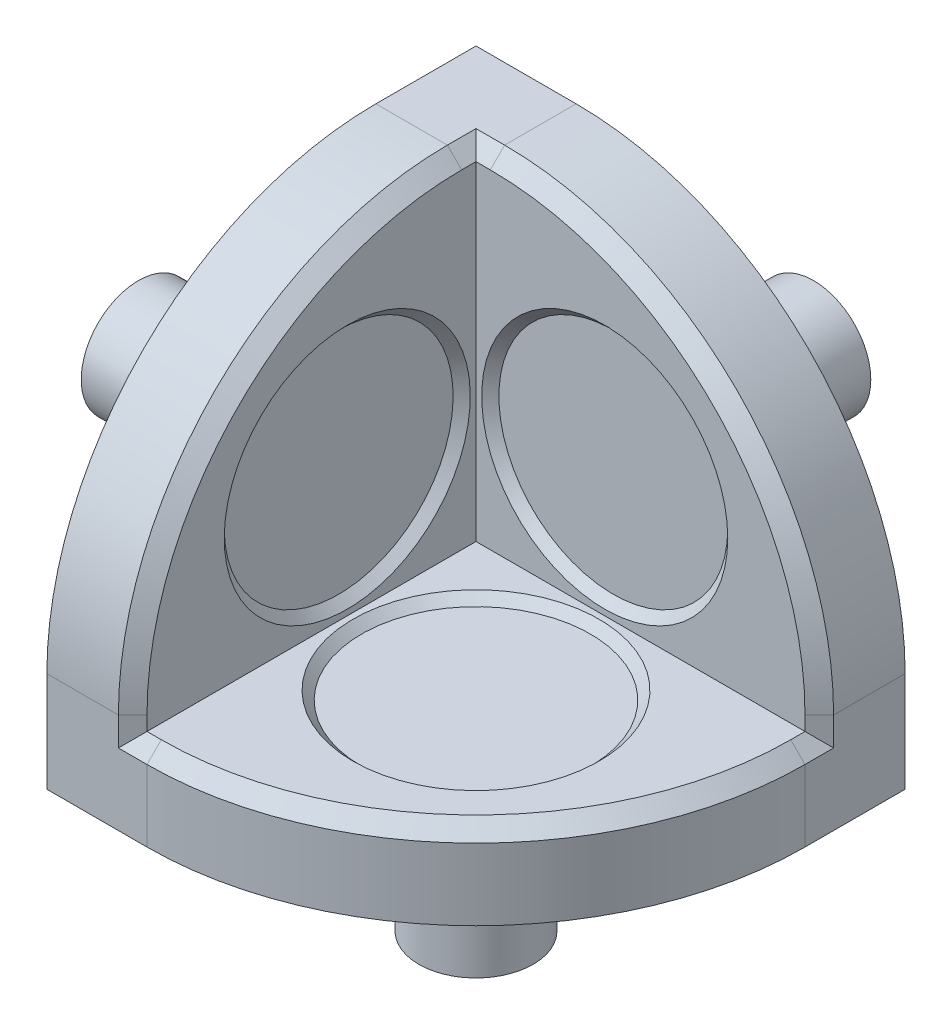
ISO-10303-21;
HEADER;
FILE_DESCRIPTION(('STEP AP214'),'2;1');
FILE_NAME('part.step','',(''),(''),'','','');
FILE_SCHEMA(('AUTOMOTIVE_DESIGN { 1 0 10303 214 1 1 1 1 }'));
ENDSEC;
DATA;
#1=APPLICATION_CONTEXT('core data for automotive mechanical design processes');
#2=APPLICATION_PROTOCOL_DEFINITION('international standard','automotive_design',2000,#1);
#3=PRODUCT_CONTEXT('',#1,'mechanical');
#4=PRODUCT('Part','Part','',(#3));
#5=PRODUCT_RELATED_PRODUCT_CATEGORY('part','',(#4));
#6=PRODUCT_DEFINITION_FORMATION('','',#4);
#7=PRODUCT_DEFINITION_CONTEXT('part definition',#1,'design');
#8=PRODUCT_DEFINITION('design','',#6,#7);
#9=PRODUCT_DEFINITION_SHAPE('','',#8);
#10=(LENGTH_UNIT() NAMED_UNIT(*) SI_UNIT(.MILLI.,.METRE.));
#11=(NAMED_UNIT(*) PLANE_ANGLE_UNIT() SI_UNIT($,.RADIAN.));
#12=(NAMED_UNIT(*) SI_UNIT($,.STERADIAN.) SOLID_ANGLE_UNIT());
#13=UNCERTAINTY_MEASURE_WITH_UNIT(LENGTH_MEASURE(1.E-05),#10,'distance_accuracy_value','');
#14=(GEOMETRIC_REPRESENTATION_CONTEXT(3) GLOBAL_UNCERTAINTY_ASSIGNED_CONTEXT((#13)) GLOBAL_UNIT_ASSIGNED_CONTEXT((#10,
#11,#12)) REPRESENTATION_CONTEXT('',''));
#15=CARTESIAN_POINT('',(0.,0.,0.));
#16=DIRECTION('',(0.,0.,1.));
#17=DIRECTION('',(1.,0.,0.));
#18=AXIS2_PLACEMENT_3D('',#15,#16,#17);
#19=CARTESIAN_POINT('',(5.4,15.,15.));
#20=DIRECTION('',(1.,0.,0.));
#21=DIRECTION('',(0.,0.,-1.));
#22=AXIS2_PLACEMENT_3D('',#19,#20,#21);
#23=PLANE('',#22);
#24=CARTESIAN_POINT('',(5.39999999999996,15.,15.));
#25=DIRECTION('',(1.,0.,0.));
#26=DIRECTION('',(0.,1.,0.));
#27=AXIS2_PLACEMENT_3D('',#24,#25,#26);
#28=CIRCLE('',#27,8.00000000000004);
#29=CARTESIAN_POINT('',(5.39999999999996,23.,15.));
#30=VERTEX_POINT('',#29);
#31=EDGE_CURVE('E19',#30,#30,#28,.T.);
#32=ORIENTED_EDGE('',*,*,#31,.T.);
#33=EDGE_LOOP('',(#32));
#34=FACE_BOUND('',#33,.T.);
#35=ADVANCED_FACE('F15',(#34),#23,.T.);
#36=CARTESIAN_POINT('',(15.,5.4,15.));
#37=DIRECTION('',(0.,1.,0.));
#38=DIRECTION('',(0.,0.,1.));
#39=AXIS2_PLACEMENT_3D('',#36,#37,#38);
#40=PLANE('',#39);
#41=CARTESIAN_POINT('',(15.,5.39999999999968,15.));
#42=DIRECTION('',(0.,1.,0.));
#43=DIRECTION('',(0.,0.,1.));
#44=AXIS2_PLACEMENT_3D('',#41,#42,#43);
#45=CIRCLE('',#44,7.99999999999977);
#46=CARTESIAN_POINT('',(15.,5.39999999999968,22.9999999999998));
#47=VERTEX_POINT('',#46);
#48=EDGE_CURVE('E358',#47,#47,#45,.T.);
#49=ORIENTED_EDGE('',*,*,#48,.T.);
#50=EDGE_LOOP('',(#49));
#51=FACE_BOUND('',#50,.T.);
#52=ADVANCED_FACE('F682',(#51),#40,.T.);
#53=CARTESIAN_POINT('',(15.,-8.6,15.));
#54=DIRECTION('',(0.,1.,0.));
#55=DIRECTION('',(0.,0.,1.));
#56=AXIS2_PLACEMENT_3D('',#53,#54,#55);
#57=PLANE('',#56);
#58=CARTESIAN_POINT('',(15.,-8.6,15.));
#59=DIRECTION('',(0.,1.,0.));
#60=DIRECTION('',(0.,0.,1.));
#61=AXIS2_PLACEMENT_3D('',#58,#59,#60);
#62=CIRCLE('',#61,4.);
#63=CARTESIAN_POINT('',(15.,-8.6,19.));
#64=VERTEX_POINT('',#63);
#65=EDGE_CURVE('E356',#64,#64,#62,.T.);
#66=ORIENTED_EDGE('',*,*,#65,.F.);
#67=EDGE_LOOP('',(#66));
#68=FACE_BOUND('',#67,.T.);
#69=ADVANCED_FACE('F382',(#68),#57,.F.);
#70=CARTESIAN_POINT('',(-8.6,15.,15.));
#71=DIRECTION('',(1.,0.,0.));
#72=DIRECTION('',(0.,0.,-1.));
#73=AXIS2_PLACEMENT_3D('',#70,#71,#72);
#74=PLANE('',#73);
#75=CARTESIAN_POINT('',(-8.6,15.,15.));
#76=DIRECTION('',(1.,0.,0.));
#77=DIRECTION('',(0.,0.,-1.));
#78=AXIS2_PLACEMENT_3D('',#75,#76,#77);
#79=CIRCLE('',#78,4.);
#80=CARTESIAN_POINT('',(-8.6,15.,11.));
#81=VERTEX_POINT('',#80);
#82=EDGE_CURVE('E353',#81,#81,#79,.T.);
#83=ORIENTED_EDGE('',*,*,#82,.F.);
#84=EDGE_LOOP('',(#83));
#85=FACE_BOUND('',#84,.T.);
#86=ADVANCED_FACE('F369',(#85),#74,.F.);
#87=CARTESIAN_POINT('',(6.00000000000004,15.,15.));
#88=DIRECTION('',(1.,0.,0.));
#89=DIRECTION('',(0.,1.,0.));
#90=AXIS2_PLACEMENT_3D('',#87,#88,#89);
#91=CONICAL_SURFACE('',#90,8.59999999999996,0.7853981633973);
#92=CARTESIAN_POINT('',(6.00000000000004,15.,15.));
#93=DIRECTION('',(1.,0.,0.));
#94=DIRECTION('',(0.,1.,0.));
#95=AXIS2_PLACEMENT_3D('',#92,#93,#94);
#96=CIRCLE('',#95,8.59999999999996);
#97=CARTESIAN_POINT('',(6.00000000000004,23.6,15.));
#98=VERTEX_POINT('',#97);
#99=EDGE_CURVE('E349',#98,#98,#96,.F.);
#100=ORIENTED_EDGE('',*,*,#99,.F.);
#101=EDGE_LOOP('',(#100));
#102=FACE_BOUND('',#101,.T.);
#103=ORIENTED_EDGE('',*,*,#31,.F.);
#104=EDGE_LOOP('',(#103));
#105=FACE_BOUND('',#104,.T.);
#106=ADVANCED_FACE('F366',(#102,#105),#91,.F.);
#107=CARTESIAN_POINT('',(15.,5.999999999997,15.));
#108=DIRECTION('',(0.,1.,0.));
#109=DIRECTION('',(0.,0.,1.));
#110=AXIS2_PLACEMENT_3D('',#107,#108,#109);
#111=CONICAL_SURFACE('',#110,8.59999999999691,0.7853981633973);
#112=CARTESIAN_POINT('',(15.,5.999999999997,15.));
#113=DIRECTION('',(0.,1.,0.));
#114=DIRECTION('',(0.,0.,1.));
#115=AXIS2_PLACEMENT_3D('',#112,#113,#114);
#116=CIRCLE('',#115,8.59999999999691);
#117=CARTESIAN_POINT('',(15.,5.999999999997,23.5999999999969));
#118=VERTEX_POINT('',#117);
#119=EDGE_CURVE('E307',#118,#118,#116,.F.);
#120=ORIENTED_EDGE('',*,*,#119,.F.);
#121=EDGE_LOOP('',(#120));
#122=FACE_BOUND('',#121,.T.);
#123=ORIENTED_EDGE('',*,*,#48,.F.);
#124=EDGE_LOOP('',(#123));
#125=FACE_BOUND('',#124,.T.);
#126=ADVANCED_FACE('F368',(#122,#125),#111,.F.);
#127=CARTESIAN_POINT('',(15.,15.,5.4));
#128=DIRECTION('',(0.,0.,1.));
#129=DIRECTION('',(1.,0.,0.));
#130=AXIS2_PLACEMENT_3D('',#127,#128,#129);
#131=PLANE('',#130);
#132=CARTESIAN_POINT('',(15.,15.,5.39999999999996));
#133=DIRECTION('',(0.,0.,1.));
#134=DIRECTION('',(1.,0.,0.));
#135=AXIS2_PLACEMENT_3D('',#132,#133,#134);
#136=CIRCLE('',#135,8.00000000000004);
#137=CARTESIAN_POINT('',(23.,15.,5.39999999999996));
#138=VERTEX_POINT('',#137);
#139=EDGE_CURVE('E344',#138,#138,#136,.T.);
#140=ORIENTED_EDGE('',*,*,#139,.T.);
#141=EDGE_LOOP('',(#140));
#142=FACE_BOUND('',#141,.T.);
#143=ADVANCED_FACE('F378',(#142),#131,.T.);
#144=CARTESIAN_POINT('',(15.,-9.3,15.));
#145=DIRECTION('',(0.,1.,0.));
#146=DIRECTION('',(0.,0.,1.));
#147=AXIS2_PLACEMENT_3D('',#144,#145,#146);
#148=CYLINDRICAL_SURFACE('',#147,4.);
#149=ORIENTED_EDGE('',*,*,#65,.T.);
#150=EDGE_LOOP('',(#149));
#151=FACE_BOUND('',#150,.T.);
#152=CARTESIAN_POINT('',(15.,1.39999999998963,15.));
#153=DIRECTION('',(0.,1.,0.));
#154=DIRECTION('',(1.,0.,0.));
#155=AXIS2_PLACEMENT_3D('',#152,#153,#154);
#156=CIRCLE('',#155,3.99999999994861);
#157=CARTESIAN_POINT('',(18.9999999999486,1.39999999998963,15.));
#158=VERTEX_POINT('',#157);
#159=EDGE_CURVE('E317',#158,#158,#156,.T.);
#160=ORIENTED_EDGE('',*,*,#159,.F.);
#161=EDGE_LOOP('',(#160));
#162=FACE_BOUND('',#161,.T.);
#163=ADVANCED_FACE('F513',(#151,#162),#148,.T.);
#164=CARTESIAN_POINT('',(-9.3,15.,15.));
#165=DIRECTION('',(1.,0.,0.));
#166=DIRECTION('',(0.,0.,-1.));
#167=AXIS2_PLACEMENT_3D('',#164,#165,#166);
#168=CYLINDRICAL_SURFACE('',#167,4.);
#169=ORIENTED_EDGE('',*,*,#82,.T.);
#170=EDGE_LOOP('',(#169));
#171=FACE_BOUND('',#170,.T.);
#172=CARTESIAN_POINT('',(1.40000000004648,15.,15.));
#173=DIRECTION('',(1.,0.,0.));
#174=DIRECTION('',(0.,-1.,0.));
#175=AXIS2_PLACEMENT_3D('',#172,#173,#174);
#176=CIRCLE('',#175,4.00000000003274);
#177=CARTESIAN_POINT('',(1.40000000004648,10.9999999999673,15.));
#178=VERTEX_POINT('',#177);
#179=EDGE_CURVE('E270',#178,#178,#176,.T.);
#180=ORIENTED_EDGE('',*,*,#179,.F.);
#181=EDGE_LOOP('',(#180));
#182=FACE_BOUND('',#181,.T.);
#183=ADVANCED_FACE('F509',(#171,#182),#168,.T.);
#184=CARTESIAN_POINT('',(6.,0.,30.));
#185=DIRECTION('',(1.,0.,0.));
#186=DIRECTION('',(0.,0.,-1.));
#187=AXIS2_PLACEMENT_3D('',#184,#185,#186);
#188=PLANE('',#187);
#189=ORIENTED_EDGE('',*,*,#99,.T.);
#190=EDGE_LOOP('',(#189));
#191=FACE_BOUND('',#190,.T.);
#192=DIRECTION('',(0.,1.,0.));
#193=VECTOR('',#192,1.);
#194=CARTESIAN_POINT('',(6.,6.,29.));
#195=LINE('',#194,#193);
#196=CARTESIAN_POINT('',(6.,6.,29.));
#197=VERTEX_POINT('',#196);
#198=CARTESIAN_POINT('',(6.00000000000007,7.,29.));
#199=VERTEX_POINT('',#198);
#200=EDGE_CURVE('E287',#197,#199,#195,.T.);
#201=ORIENTED_EDGE('',*,*,#200,.F.);
#202=DIRECTION('',(0.,0.,1.));
#203=VECTOR('',#202,1.);
#204=CARTESIAN_POINT('',(6.,6.,0.));
#205=LINE('',#204,#203);
#206=CARTESIAN_POINT('',(6.,6.,6.));
#207=VERTEX_POINT('',#206);
#208=EDGE_CURVE('E93',#207,#197,#205,.T.);
#209=ORIENTED_EDGE('',*,*,#208,.F.);
#210=DIRECTION('',(0.,1.,0.));
#211=VECTOR('',#210,1.);
#212=CARTESIAN_POINT('',(6.,0.,6.));
#213=LINE('',#212,#211);
#214=CARTESIAN_POINT('',(6.,29.,6.));
#215=VERTEX_POINT('',#214);
#216=EDGE_CURVE('E260',#215,#207,#213,.F.);
#217=ORIENTED_EDGE('',*,*,#216,.F.);
#218=DIRECTION('',(0.,0.,-1.));
#219=VECTOR('',#218,1.);
#220=CARTESIAN_POINT('',(6.,29.,30.));
#221=LINE('',#220,#219);
#222=CARTESIAN_POINT('',(6.00000000000007,29.,7.));
#223=VERTEX_POINT('',#222);
#224=EDGE_CURVE('E352',#215,#223,#221,.F.);
#225=ORIENTED_EDGE('',*,*,#224,.T.);
#226=CARTESIAN_POINT('',(6.00000000000007,7.,7.));
#227=DIRECTION('',(-1.,0.,0.));
#228=DIRECTION('',(0.,-1.,0.));
#229=AXIS2_PLACEMENT_3D('',#226,#227,#228);
#230=CIRCLE('',#229,22.0000000000001);
#231=EDGE_CURVE('E264',#199,#223,#230,.T.);
#232=ORIENTED_EDGE('',*,*,#231,.F.);
#233=EDGE_LOOP('',(#201,#209,#217,#225,#232));
#234=FACE_BOUND('',#233,.T.);
#235=ADVANCED_FACE('F505',(#191,#234),#188,.T.);
#236=CARTESIAN_POINT('',(0.,6.,0.));
#237=DIRECTION('',(0.,1.,0.));
#238=DIRECTION('',(0.,0.,1.));
#239=AXIS2_PLACEMENT_3D('',#236,#237,#238);
#240=PLANE('',#239);
#241=ORIENTED_EDGE('',*,*,#119,.T.);
#242=EDGE_LOOP('',(#241));
#243=FACE_BOUND('',#242,.T.);
#244=DIRECTION('',(1.,0.,0.));
#245=VECTOR('',#244,1.);
#246=CARTESIAN_POINT('',(6.,6.,6.));
#247=LINE('',#246,#245);
#248=CARTESIAN_POINT('',(29.,6.,6.));
#249=VERTEX_POINT('',#248);
#250=EDGE_CURVE('E263',#207,#249,#247,.T.);
#251=ORIENTED_EDGE('',*,*,#250,.F.);
#252=ORIENTED_EDGE('',*,*,#208,.T.);
#253=DIRECTION('',(1.,0.,0.));
#254=VECTOR('',#253,1.);
#255=CARTESIAN_POINT('',(6.,6.,29.));
#256=LINE('',#255,#254);
#257=CARTESIAN_POINT('',(7.,6.00000000000004,29.));
#258=VERTEX_POINT('',#257);
#259=EDGE_CURVE('E296',#197,#258,#256,.T.);
#260=ORIENTED_EDGE('',*,*,#259,.T.);
#261=CARTESIAN_POINT('',(7.,6.00000000000007,7.));
#262=DIRECTION('',(0.,-1.,0.));
#263=DIRECTION('',(0.,0.,-1.));
#264=AXIS2_PLACEMENT_3D('',#261,#262,#263);
#265=CIRCLE('',#264,22.0000000000001);
#266=CARTESIAN_POINT('',(29.,6.00000000000004,7.));
#267=VERTEX_POINT('',#266);
#268=EDGE_CURVE('E321',#267,#258,#265,.T.);
#269=ORIENTED_EDGE('',*,*,#268,.F.);
#270=DIRECTION('',(0.,0.,1.));
#271=VECTOR('',#270,1.);
#272=CARTESIAN_POINT('',(29.,6.,0.));
#273=LINE('',#272,#271);
#274=EDGE_CURVE('E84',#267,#249,#273,.F.);
#275=ORIENTED_EDGE('',*,*,#274,.T.);
#276=EDGE_LOOP('',(#251,#252,#260,#269,#275));
#277=FACE_BOUND('',#276,.T.);
#278=ADVANCED_FACE('F501',(#243,#277),#240,.T.);
#279=CARTESIAN_POINT('',(15.,15.,6.00000000000004));
#280=DIRECTION('',(0.,0.,1.));
#281=DIRECTION('',(1.,0.,0.));
#282=AXIS2_PLACEMENT_3D('',#279,#280,#281);
#283=CONICAL_SURFACE('',#282,8.59999999999996,0.7853981633973);
#284=CARTESIAN_POINT('',(15.,15.,6.00000000000004));
#285=DIRECTION('',(0.,0.,1.));
#286=DIRECTION('',(1.,0.,0.));
#287=AXIS2_PLACEMENT_3D('',#284,#285,#286);
#288=CIRCLE('',#287,8.59999999999996);
#289=CARTESIAN_POINT('',(23.6,15.,6.00000000000004));
#290=VERTEX_POINT('',#289);
#291=EDGE_CURVE('E303',#290,#290,#288,.F.);
#292=ORIENTED_EDGE('',*,*,#291,.F.);
#293=EDGE_LOOP('',(#292));
#294=FACE_BOUND('',#293,.T.);
#295=ORIENTED_EDGE('',*,*,#139,.F.);
#296=EDGE_LOOP('',(#295));
#297=FACE_BOUND('',#296,.T.);
#298=ADVANCED_FACE('F497',(#294,#297),#283,.F.);
#299=CARTESIAN_POINT('',(15.,15.,-8.6));
#300=DIRECTION('',(0.,0.,1.));
#301=DIRECTION('',(1.,0.,0.));
#302=AXIS2_PLACEMENT_3D('',#299,#300,#301);
#303=PLANE('',#302);
#304=CARTESIAN_POINT('',(15.,15.,-8.6));
#305=DIRECTION('',(0.,0.,1.));
#306=DIRECTION('',(1.,0.,0.));
#307=AXIS2_PLACEMENT_3D('',#304,#305,#306);
#308=CIRCLE('',#307,4.);
#309=CARTESIAN_POINT('',(19.,15.,-8.6));
#310=VERTEX_POINT('',#309);
#311=EDGE_CURVE('E257',#310,#310,#308,.T.);
#312=ORIENTED_EDGE('',*,*,#311,.F.);
#313=EDGE_LOOP('',(#312));
#314=FACE_BOUND('',#313,.T.);
#315=ADVANCED_FACE('F493',(#314),#303,.F.);
#316=CARTESIAN_POINT('',(7.,4.99999999999993,7.));
#317=DIRECTION('',(0.,-1.,0.));
#318=DIRECTION('',(0.,0.,-1.));
#319=AXIS2_PLACEMENT_3D('',#316,#317,#318);
#320=CONICAL_SURFACE('',#319,22.9999999999999,0.785398163397301);
#321=DIRECTION('',(0.707106781186548,-0.707106781186548,0.));
#322=VECTOR('',#321,1.);
#323=CARTESIAN_POINT('',(29.,6.,7.));
#324=LINE('',#323,#322);
#325=CARTESIAN_POINT('',(30.,5.,7.));
#326=VERTEX_POINT('',#325);
#327=EDGE_CURVE('E233',#326,#267,#324,.F.);
#328=ORIENTED_EDGE('',*,*,#327,.T.);
#329=ORIENTED_EDGE('',*,*,#268,.T.);
#330=DIRECTION('',(0.,0.707106781186548,-0.707106781186548));
#331=VECTOR('',#330,1.);
#332=CARTESIAN_POINT('',(7.,6.,29.));
#333=LINE('',#332,#331);
#334=CARTESIAN_POINT('',(7.,5.,30.));
#335=VERTEX_POINT('',#334);
#336=EDGE_CURVE('E288',#258,#335,#333,.F.);
#337=ORIENTED_EDGE('',*,*,#336,.T.);
#338=CARTESIAN_POINT('',(7.,5.,7.));
#339=DIRECTION('',(0.,1.,0.));
#340=DIRECTION('',(0.,0.,1.));
#341=AXIS2_PLACEMENT_3D('',#338,#339,#340);
#342=CIRCLE('',#341,23.);
#343=EDGE_CURVE('E230',#326,#335,#342,.F.);
#344=ORIENTED_EDGE('',*,*,#343,.F.);
#345=EDGE_LOOP('',(#328,#329,#337,#344));
#346=FACE_BOUND('',#345,.T.);
#347=ADVANCED_FACE('F489',(#346),#320,.T.);
#348=CARTESIAN_POINT('',(15.,1.89999999992096,15.));
#349=DIRECTION('',(0.,1.,0.));
#350=DIRECTION('',(0.,0.,1.));
#351=AXIS2_PLACEMENT_3D('',#348,#349,#350);
#352=CONICAL_SURFACE('',#351,4.49999999987995,0.785398163340605);
#353=ORIENTED_EDGE('',*,*,#159,.T.);
#354=EDGE_LOOP('',(#353));
#355=FACE_BOUND('',#354,.T.);
#356=CARTESIAN_POINT('',(15.,1.9,15.));
#357=DIRECTION('',(0.,-1.,0.));
#358=DIRECTION('',(0.,0.,-1.));
#359=AXIS2_PLACEMENT_3D('',#356,#357,#358);
#360=CIRCLE('',#359,4.5);
#361=CARTESIAN_POINT('',(15.,1.9,10.5));
#362=VERTEX_POINT('',#361);
#363=EDGE_CURVE('E227',#362,#362,#360,.T.);
#364=ORIENTED_EDGE('',*,*,#363,.T.);
#365=EDGE_LOOP('',(#364));
#366=FACE_BOUND('',#365,.T.);
#367=ADVANCED_FACE('F485',(#355,#366),#352,.T.);
#368=CARTESIAN_POINT('',(6.,6.,29.));
#369=DIRECTION('',(0.,-0.707106781186548,-0.707106781186548));
#370=DIRECTION('',(0.,0.707106781186548,-0.707106781186548));
#371=AXIS2_PLACEMENT_3D('',#368,#369,#370);
#372=PLANE('',#371);
#373=DIRECTION('',(1.,0.,0.));
#374=VECTOR('',#373,1.);
#375=CARTESIAN_POINT('',(0.,5.,30.));
#376=LINE('',#375,#374);
#377=CARTESIAN_POINT('',(5.,5.,30.));
#378=VERTEX_POINT('',#377);
#379=EDGE_CURVE('E226',#335,#378,#376,.F.);
#380=ORIENTED_EDGE('',*,*,#379,.F.);
#381=ORIENTED_EDGE('',*,*,#336,.F.);
#382=ORIENTED_EDGE('',*,*,#259,.F.);
#383=DIRECTION('',(0.577350269189625,0.577350269189627,-0.577350269189625));
#384=VECTOR('',#383,1.);
#385=CARTESIAN_POINT('',(5.,5.,30.));
#386=LINE('',#385,#384);
#387=EDGE_CURVE('E284',#378,#197,#386,.T.);
#388=ORIENTED_EDGE('',*,*,#387,.F.);
#389=EDGE_LOOP('',(#380,#381,#382,#388));
#390=FACE_BOUND('',#389,.T.);
#391=ADVANCED_FACE('F481',(#390),#372,.F.);
#392=CARTESIAN_POINT('',(6.,6.,29.));
#393=DIRECTION('',(0.707106781186548,0.,0.707106781186548));
#394=DIRECTION('',(0.707106781186548,0.,-0.707106781186548));
#395=AXIS2_PLACEMENT_3D('',#392,#393,#394);
#396=PLANE('',#395);
#397=ORIENTED_EDGE('',*,*,#387,.T.);
#398=ORIENTED_EDGE('',*,*,#200,.T.);
#399=DIRECTION('',(0.707106781186652,0.,-0.707106781186443));
#400=VECTOR('',#399,1.);
#401=CARTESIAN_POINT('',(5.5,7.,29.5));
#402=LINE('',#401,#400);
#403=CARTESIAN_POINT('',(4.99999999999998,6.999999923171,30.));
#404=VERTEX_POINT('',#403);
#405=EDGE_CURVE('E269',#404,#199,#402,.T.);
#406=ORIENTED_EDGE('',*,*,#405,.F.);
#407=DIRECTION('',(0.,1.,0.));
#408=VECTOR('',#407,1.);
#409=CARTESIAN_POINT('',(5.,0.,30.));
#410=LINE('',#409,#408);
#411=EDGE_CURVE('E277',#378,#404,#410,.T.);
#412=ORIENTED_EDGE('',*,*,#411,.F.);
#413=EDGE_LOOP('',(#397,#398,#406,#412));
#414=FACE_BOUND('',#413,.T.);
#415=ADVANCED_FACE('F477',(#414),#396,.T.);
#416=CARTESIAN_POINT('',(1.89999999986412,15.,15.));
#417=DIRECTION('',(1.,0.,0.));
#418=DIRECTION('',(0.,0.,-1.));
#419=AXIS2_PLACEMENT_3D('',#416,#417,#418);
#420=CONICAL_SURFACE('',#419,4.49999999985039,0.785398163340605);
#421=ORIENTED_EDGE('',*,*,#179,.T.);
#422=EDGE_LOOP('',(#421));
#423=FACE_BOUND('',#422,.T.);
#424=CARTESIAN_POINT('',(1.9,15.,15.));
#425=DIRECTION('',(-1.,0.,0.));
#426=DIRECTION('',(0.,0.,1.));
#427=AXIS2_PLACEMENT_3D('',#424,#425,#426);
#428=CIRCLE('',#427,4.5);
#429=CARTESIAN_POINT('',(1.9,15.,19.5));
#430=VERTEX_POINT('',#429);
#431=EDGE_CURVE('E215',#430,#430,#428,.T.);
#432=ORIENTED_EDGE('',*,*,#431,.T.);
#433=EDGE_LOOP('',(#432));
#434=FACE_BOUND('',#433,.T.);
#435=ADVANCED_FACE('F473',(#423,#434),#420,.T.);
#436=CARTESIAN_POINT('',(4.99999999999993,7.,7.));
#437=DIRECTION('',(-1.,0.,0.));
#438=DIRECTION('',(0.,-1.,0.));
#439=AXIS2_PLACEMENT_3D('',#436,#437,#438);
#440=CONICAL_SURFACE('',#439,22.9999999999999,0.785398163397301);
#441=ORIENTED_EDGE('',*,*,#405,.T.);
#442=ORIENTED_EDGE('',*,*,#231,.T.);
#443=DIRECTION('',(0.707106781186652,-0.707106781186443,0.));
#444=VECTOR('',#443,1.);
#445=CARTESIAN_POINT('',(5.5,29.5,7.));
#446=LINE('',#445,#444);
#447=CARTESIAN_POINT('',(4.99999999999998,30.,7.));
#448=VERTEX_POINT('',#447);
#449=EDGE_CURVE('E267',#223,#448,#446,.F.);
#450=ORIENTED_EDGE('',*,*,#449,.T.);
#451=CARTESIAN_POINT('',(5.,7.,7.));
#452=DIRECTION('',(1.,0.,0.));
#453=DIRECTION('',(0.,0.,-1.));
#454=AXIS2_PLACEMENT_3D('',#451,#452,#453);
#455=CIRCLE('',#454,23.);
#456=EDGE_CURVE('E207',#404,#448,#455,.F.);
#457=ORIENTED_EDGE('',*,*,#456,.F.);
#458=EDGE_LOOP('',(#441,#442,#450,#457));
#459=FACE_BOUND('',#458,.T.);
#460=ADVANCED_FACE('F469',(#459),#440,.T.);
#461=CARTESIAN_POINT('',(6.,0.,6.));
#462=DIRECTION('',(0.,0.,1.));
#463=DIRECTION('',(1.,0.,0.));
#464=AXIS2_PLACEMENT_3D('',#461,#462,#463);
#465=PLANE('',#464);
#466=ORIENTED_EDGE('',*,*,#291,.T.);
#467=EDGE_LOOP('',(#466));
#468=FACE_BOUND('',#467,.T.);
#469=ORIENTED_EDGE('',*,*,#216,.T.);
#470=ORIENTED_EDGE('',*,*,#250,.T.);
#471=DIRECTION('',(0.,1.,0.));
#472=VECTOR('',#471,1.);
#473=CARTESIAN_POINT('',(29.,6.,6.));
#474=LINE('',#473,#472);
#475=CARTESIAN_POINT('',(29.,7.,6.00000000000007));
#476=VERTEX_POINT('',#475);
#477=EDGE_CURVE('E246',#476,#249,#474,.F.);
#478=ORIENTED_EDGE('',*,*,#477,.F.);
#479=CARTESIAN_POINT('',(7.,7.,6.00000000000007));
#480=DIRECTION('',(0.,0.,-1.));
#481=DIRECTION('',(0.,1.,0.));
#482=AXIS2_PLACEMENT_3D('',#479,#480,#481);
#483=CIRCLE('',#482,22.0000000000001);
#484=CARTESIAN_POINT('',(7.,29.,6.00000000000007));
#485=VERTEX_POINT('',#484);
#486=EDGE_CURVE('E185',#485,#476,#483,.T.);
#487=ORIENTED_EDGE('',*,*,#486,.F.);
#488=DIRECTION('',(1.,0.,0.));
#489=VECTOR('',#488,1.);
#490=CARTESIAN_POINT('',(6.,29.,6.));
#491=LINE('',#490,#489);
#492=EDGE_CURVE('E195',#485,#215,#491,.F.);
#493=ORIENTED_EDGE('',*,*,#492,.T.);
#494=EDGE_LOOP('',(#469,#470,#478,#487,#493));
#495=FACE_BOUND('',#494,.T.);
#496=ADVANCED_FACE('F465',(#468,#495),#465,.T.);
#497=CARTESIAN_POINT('',(15.,15.,-9.3));
#498=DIRECTION('',(0.,0.,1.));
#499=DIRECTION('',(1.,0.,0.));
#500=AXIS2_PLACEMENT_3D('',#497,#498,#499);
#501=CYLINDRICAL_SURFACE('',#500,4.);
#502=ORIENTED_EDGE('',*,*,#311,.T.);
#503=EDGE_LOOP('',(#502));
#504=FACE_BOUND('',#503,.T.);
#505=CARTESIAN_POINT('',(15.,15.,1.39999999998963));
#506=DIRECTION('',(0.,0.,1.));
#507=DIRECTION('',(0.,1.,0.));
#508=AXIS2_PLACEMENT_3D('',#505,#506,#507);
#509=CIRCLE('',#508,3.99999999994861);
#510=CARTESIAN_POINT('',(15.,18.9999999999486,1.39999999998963));
#511=VERTEX_POINT('',#510);
#512=EDGE_CURVE('E179',#511,#511,#509,.T.);
#513=ORIENTED_EDGE('',*,*,#512,.F.);
#514=EDGE_LOOP('',(#513));
#515=FACE_BOUND('',#514,.T.);
#516=ADVANCED_FACE('F461',(#504,#515),#501,.T.);
#517=CARTESIAN_POINT('',(30.,6.,5.));
#518=DIRECTION('',(0.707106781186548,0.,0.707106781186548));
#519=DIRECTION('',(0.707106781186548,0.,-0.707106781186548));
#520=AXIS2_PLACEMENT_3D('',#517,#518,#519);
#521=PLANE('',#520);
#522=DIRECTION('',(0.577350269189625,-0.577350269189625,-0.577350269189627));
#523=VECTOR('',#522,1.);
#524=CARTESIAN_POINT('',(29.,6.,6.));
#525=LINE('',#524,#523);
#526=CARTESIAN_POINT('',(30.,5.,5.));
#527=VERTEX_POINT('',#526);
#528=EDGE_CURVE('E242',#249,#527,#525,.T.);
#529=ORIENTED_EDGE('',*,*,#528,.T.);
#530=DIRECTION('',(0.,1.,0.));
#531=VECTOR('',#530,1.);
#532=CARTESIAN_POINT('',(30.,0.,5.));
#533=LINE('',#532,#531);
#534=CARTESIAN_POINT('',(30.,7.,4.99999999999998));
#535=VERTEX_POINT('',#534);
#536=EDGE_CURVE('E175',#535,#527,#533,.F.);
#537=ORIENTED_EDGE('',*,*,#536,.F.);
#538=DIRECTION('',(-0.707106781186443,0.,0.707106781186652));
#539=VECTOR('',#538,1.);
#540=CARTESIAN_POINT('',(29.5,7.,5.5));
#541=LINE('',#540,#539);
#542=EDGE_CURVE('E186',#476,#535,#541,.F.);
#543=ORIENTED_EDGE('',*,*,#542,.F.);
#544=ORIENTED_EDGE('',*,*,#477,.T.);
#545=EDGE_LOOP('',(#529,#537,#543,#544));
#546=FACE_BOUND('',#545,.T.);
#547=ADVANCED_FACE('F458',(#546),#521,.T.);
#548=CARTESIAN_POINT('',(29.,6.,7.));
#549=DIRECTION('',(-0.707106781186548,-0.707106781186548,0.));
#550=DIRECTION('',(0.707106781186548,-0.707106781186548,0.));
#551=AXIS2_PLACEMENT_3D('',#548,#549,#550);
#552=PLANE('',#551);
#553=DIRECTION('',(0.,0.,-1.));
#554=VECTOR('',#553,1.);
#555=CARTESIAN_POINT('',(30.,5.,6.));
#556=LINE('',#555,#554);
#557=EDGE_CURVE('E178',#527,#326,#556,.F.);
#558=ORIENTED_EDGE('',*,*,#557,.F.);
#559=ORIENTED_EDGE('',*,*,#528,.F.);
#560=ORIENTED_EDGE('',*,*,#274,.F.);
#561=ORIENTED_EDGE('',*,*,#327,.F.);
#562=EDGE_LOOP('',(#558,#559,#560,#561));
#563=FACE_BOUND('',#562,.T.);
#564=ADVANCED_FACE('F454',(#563),#552,.F.);
#565=CARTESIAN_POINT('',(7.,0.,7.));
#566=DIRECTION('',(0.,1.,0.));
#567=DIRECTION('',(0.,0.,1.));
#568=AXIS2_PLACEMENT_3D('',#565,#566,#567);
#569=CYLINDRICAL_SURFACE('',#568,23.);
#570=DIRECTION('',(0.,1.,0.));
#571=VECTOR('',#570,1.);
#572=CARTESIAN_POINT('',(7.,0.,30.));
#573=LINE('',#572,#571);
#574=CARTESIAN_POINT('',(7.,0.,30.));
#575=VERTEX_POINT('',#574);
#576=EDGE_CURVE('E223',#575,#335,#573,.T.);
#577=ORIENTED_EDGE('',*,*,#576,.F.);
#578=CARTESIAN_POINT('',(7.,0.,7.));
#579=DIRECTION('',(0.,1.,0.));
#580=DIRECTION('',(0.,0.,1.));
#581=AXIS2_PLACEMENT_3D('',#578,#579,#580);
#582=CIRCLE('',#581,23.);
#583=CARTESIAN_POINT('',(30.,0.,7.));
#584=VERTEX_POINT('',#583);
#585=EDGE_CURVE('E332',#575,#584,#582,.T.);
#586=ORIENTED_EDGE('',*,*,#585,.T.);
#587=DIRECTION('',(0.,1.,0.));
#588=VECTOR('',#587,1.);
#589=CARTESIAN_POINT('',(30.,0.,7.));
#590=LINE('',#589,#588);
#591=EDGE_CURVE('E218',#326,#584,#590,.F.);
#592=ORIENTED_EDGE('',*,*,#591,.F.);
#593=ORIENTED_EDGE('',*,*,#343,.T.);
#594=EDGE_LOOP('',(#577,#586,#592,#593));
#595=FACE_BOUND('',#594,.T.);
#596=ADVANCED_FACE('F450',(#595),#569,.T.);
#597=CARTESIAN_POINT('',(15.,6.3,15.));
#598=DIRECTION('',(0.,-1.,0.));
#599=DIRECTION('',(0.,0.,-1.));
#600=AXIS2_PLACEMENT_3D('',#597,#598,#599);
#601=CYLINDRICAL_SURFACE('',#600,4.5);
#602=CARTESIAN_POINT('',(15.,0.,15.));
#603=DIRECTION('',(0.,-1.,0.));
#604=DIRECTION('',(0.,0.,-1.));
#605=AXIS2_PLACEMENT_3D('',#602,#603,#604);
#606=CIRCLE('',#605,4.5);
#607=CARTESIAN_POINT('',(15.,0.,10.5));
#608=VERTEX_POINT('',#607);
#609=EDGE_CURVE('E141',#608,#608,#606,.T.);
#610=ORIENTED_EDGE('',*,*,#609,.T.);
#611=EDGE_LOOP('',(#610));
#612=FACE_BOUND('',#611,.T.);
#613=ORIENTED_EDGE('',*,*,#363,.F.);
#614=EDGE_LOOP('',(#613));
#615=FACE_BOUND('',#614,.T.);
#616=ADVANCED_FACE('F446',(#612,#615),#601,.F.);
#617=CARTESIAN_POINT('',(0.,0.,30.));
#618=DIRECTION('',(0.,0.,1.));
#619=DIRECTION('',(1.,0.,0.));
#620=AXIS2_PLACEMENT_3D('',#617,#618,#619);
#621=PLANE('',#620);
#622=ORIENTED_EDGE('',*,*,#379,.T.);
#623=ORIENTED_EDGE('',*,*,#411,.T.);
#624=DIRECTION('',(1.,0.,0.));
#625=VECTOR('',#624,1.);
#626=CARTESIAN_POINT('',(6.,6.999999846342,30.));
#627=LINE('',#626,#625);
#628=CARTESIAN_POINT('',(0.,6.999999923171,30.));
#629=VERTEX_POINT('',#628);
#630=EDGE_CURVE('E210',#629,#404,#627,.T.);
#631=ORIENTED_EDGE('',*,*,#630,.F.);
#632=DIRECTION('',(0.,1.,0.));
#633=VECTOR('',#632,1.);
#634=CARTESIAN_POINT('',(0.,0.,30.));
#635=LINE('',#634,#633);
#636=CARTESIAN_POINT('',(0.,0.,30.));
#637=VERTEX_POINT('',#636);
#638=EDGE_CURVE('E140',#637,#629,#635,.T.);
#639=ORIENTED_EDGE('',*,*,#638,.F.);
#640=DIRECTION('',(1.,0.,0.));
#641=VECTOR('',#640,1.);
#642=CARTESIAN_POINT('',(0.,0.,30.));
#643=LINE('',#642,#641);
#644=EDGE_CURVE('E136',#637,#575,#643,.T.);
#645=ORIENTED_EDGE('',*,*,#644,.T.);
#646=ORIENTED_EDGE('',*,*,#576,.T.);
#647=EDGE_LOOP('',(#622,#623,#631,#639,#645,#646));
#648=FACE_BOUND('',#647,.T.);
#649=ADVANCED_FACE('F442',(#648),#621,.T.);
#650=CARTESIAN_POINT('',(6.3,15.,15.));
#651=DIRECTION('',(-1.,0.,0.));
#652=DIRECTION('',(0.,0.,1.));
#653=AXIS2_PLACEMENT_3D('',#650,#651,#652);
#654=CYLINDRICAL_SURFACE('',#653,4.5);
#655=CARTESIAN_POINT('',(0.,15.,15.));
#656=DIRECTION('',(-1.,0.,0.));
#657=DIRECTION('',(0.,0.,1.));
#658=AXIS2_PLACEMENT_3D('',#655,#656,#657);
#659=CIRCLE('',#658,4.5);
#660=CARTESIAN_POINT('',(0.,15.,19.5));
#661=VERTEX_POINT('',#660);
#662=EDGE_CURVE('E324',#661,#661,#659,.F.);
#663=ORIENTED_EDGE('',*,*,#662,.F.);
#664=EDGE_LOOP('',(#663));
#665=FACE_BOUND('',#664,.T.);
#666=ORIENTED_EDGE('',*,*,#431,.F.);
#667=EDGE_LOOP('',(#666));
#668=FACE_BOUND('',#667,.T.);
#669=ADVANCED_FACE('F438',(#665,#668),#654,.F.);
#670=CARTESIAN_POINT('',(6.,7.,7.));
#671=DIRECTION('',(1.,0.,0.));
#672=DIRECTION('',(0.,0.,-1.));
#673=AXIS2_PLACEMENT_3D('',#670,#671,#672);
#674=CYLINDRICAL_SURFACE('',#673,23.);
#675=ORIENTED_EDGE('',*,*,#456,.T.);
#676=DIRECTION('',(1.,0.,0.));
#677=VECTOR('',#676,1.);
#678=CARTESIAN_POINT('',(0.,30.,7.));
#679=LINE('',#678,#677);
#680=CARTESIAN_POINT('',(0.,30.,7.));
#681=VERTEX_POINT('',#680);
#682=EDGE_CURVE('E200',#681,#448,#679,.T.);
#683=ORIENTED_EDGE('',*,*,#682,.F.);
#684=CARTESIAN_POINT('',(0.,7.,7.));
#685=DIRECTION('',(1.,0.,0.));
#686=DIRECTION('',(0.,0.,-1.));
#687=AXIS2_PLACEMENT_3D('',#684,#685,#686);
#688=CIRCLE('',#687,23.);
#689=EDGE_CURVE('E327',#629,#681,#688,.F.);
#690=ORIENTED_EDGE('',*,*,#689,.F.);
#691=ORIENTED_EDGE('',*,*,#630,.T.);
#692=EDGE_LOOP('',(#675,#683,#690,#691));
#693=FACE_BOUND('',#692,.T.);
#694=ADVANCED_FACE('F434',(#693),#674,.T.);
#695=CARTESIAN_POINT('',(5.,30.,7.));
#696=DIRECTION('',(-0.707106781186548,-0.707106781186548,0.));
#697=DIRECTION('',(0.707106781186548,-0.707106781186548,0.));
#698=AXIS2_PLACEMENT_3D('',#695,#696,#697);
#699=PLANE('',#698);
#700=ORIENTED_EDGE('',*,*,#224,.F.);
#701=DIRECTION('',(-0.577350269189627,0.577350269189625,-0.577350269189625));
#702=VECTOR('',#701,1.);
#703=CARTESIAN_POINT('',(6.,29.,6.));
#704=LINE('',#703,#702);
#705=CARTESIAN_POINT('',(5.,30.,5.));
#706=VERTEX_POINT('',#705);
#707=EDGE_CURVE('E191',#215,#706,#704,.T.);
#708=ORIENTED_EDGE('',*,*,#707,.T.);
#709=DIRECTION('',(0.,0.,1.));
#710=VECTOR('',#709,1.);
#711=CARTESIAN_POINT('',(5.,30.,0.));
#712=LINE('',#711,#710);
#713=EDGE_CURVE('E167',#448,#706,#712,.F.);
#714=ORIENTED_EDGE('',*,*,#713,.F.);
#715=ORIENTED_EDGE('',*,*,#449,.F.);
#716=EDGE_LOOP('',(#700,#708,#714,#715));
#717=FACE_BOUND('',#716,.T.);
#718=ADVANCED_FACE('F430',(#717),#699,.F.);
#719=CARTESIAN_POINT('',(6.,30.,5.));
#720=DIRECTION('',(0.,-0.707106781186548,-0.707106781186548));
#721=DIRECTION('',(0.,0.707106781186548,-0.707106781186548));
#722=AXIS2_PLACEMENT_3D('',#719,#720,#721);
#723=PLANE('',#722);
#724=ORIENTED_EDGE('',*,*,#492,.F.);
#725=DIRECTION('',(0.,-0.707106781186443,0.707106781186652));
#726=VECTOR('',#725,1.);
#727=CARTESIAN_POINT('',(7.,29.5,5.5));
#728=LINE('',#727,#726);
#729=CARTESIAN_POINT('',(7.,30.,4.99999999999998));
#730=VERTEX_POINT('',#729);
#731=EDGE_CURVE('E182',#730,#485,#728,.T.);
#732=ORIENTED_EDGE('',*,*,#731,.F.);
#733=DIRECTION('',(1.,0.,0.));
#734=VECTOR('',#733,1.);
#735=CARTESIAN_POINT('',(0.,30.,5.));
#736=LINE('',#735,#734);
#737=EDGE_CURVE('E164',#706,#730,#736,.T.);
#738=ORIENTED_EDGE('',*,*,#737,.F.);
#739=ORIENTED_EDGE('',*,*,#707,.F.);
#740=EDGE_LOOP('',(#724,#732,#738,#739));
#741=FACE_BOUND('',#740,.T.);
#742=ADVANCED_FACE('F426',(#741),#723,.F.);
#743=CARTESIAN_POINT('',(7.,7.,4.99999999999993));
#744=DIRECTION('',(0.,0.,-1.));
#745=DIRECTION('',(0.,1.,0.));
#746=AXIS2_PLACEMENT_3D('',#743,#744,#745);
#747=CONICAL_SURFACE('',#746,22.9999999999999,0.785398163397301);
#748=ORIENTED_EDGE('',*,*,#731,.T.);
#749=ORIENTED_EDGE('',*,*,#486,.T.);
#750=ORIENTED_EDGE('',*,*,#542,.T.);
#751=CARTESIAN_POINT('',(7.,7.,5.));
#752=DIRECTION('',(0.,0.,1.));
#753=DIRECTION('',(1.,0.,0.));
#754=AXIS2_PLACEMENT_3D('',#751,#752,#753);
#755=CIRCLE('',#754,23.);
#756=EDGE_CURVE('E166',#730,#535,#755,.F.);
#757=ORIENTED_EDGE('',*,*,#756,.F.);
#758=EDGE_LOOP('',(#748,#749,#750,#757));
#759=FACE_BOUND('',#758,.T.);
#760=ADVANCED_FACE('F422',(#759),#747,.T.);
#761=CARTESIAN_POINT('',(15.,15.,1.89999999992096));
#762=DIRECTION('',(0.,0.,1.));
#763=DIRECTION('',(1.,0.,0.));
#764=AXIS2_PLACEMENT_3D('',#761,#762,#763);
#765=CONICAL_SURFACE('',#764,4.49999999987995,0.785398163340605);
#766=ORIENTED_EDGE('',*,*,#512,.T.);
#767=EDGE_LOOP('',(#766));
#768=FACE_BOUND('',#767,.T.);
#769=CARTESIAN_POINT('',(15.,15.,1.9));
#770=DIRECTION('',(0.,0.,-1.));
#771=DIRECTION('',(-1.,0.,0.));
#772=AXIS2_PLACEMENT_3D('',#769,#770,#771);
#773=CIRCLE('',#772,4.5);
#774=CARTESIAN_POINT('',(10.5,15.,1.9));
#775=VERTEX_POINT('',#774);
#776=EDGE_CURVE('E155',#775,#775,#773,.T.);
#777=ORIENTED_EDGE('',*,*,#776,.T.);
#778=EDGE_LOOP('',(#777));
#779=FACE_BOUND('',#778,.T.);
#780=ADVANCED_FACE('F418',(#768,#779),#765,.T.);
#781=CARTESIAN_POINT('',(30.,0.,6.));
#782=DIRECTION('',(1.,0.,0.));
#783=DIRECTION('',(0.,0.,-1.));
#784=AXIS2_PLACEMENT_3D('',#781,#782,#783);
#785=PLANE('',#784);
#786=ORIENTED_EDGE('',*,*,#591,.T.);
#787=DIRECTION('',(0.,0.,1.));
#788=VECTOR('',#787,1.);
#789=CARTESIAN_POINT('',(30.,0.,0.));
#790=LINE('',#789,#788);
#791=CARTESIAN_POINT('',(30.,0.,0.));
#792=VERTEX_POINT('',#791);
#793=EDGE_CURVE('E331',#584,#792,#790,.F.);
#794=ORIENTED_EDGE('',*,*,#793,.T.);
#795=DIRECTION('',(0.,1.,0.));
#796=VECTOR('',#795,1.);
#797=CARTESIAN_POINT('',(30.,0.,0.));
#798=LINE('',#797,#796);
#799=CARTESIAN_POINT('',(30.,7.,0.));
#800=VERTEX_POINT('',#799);
#801=EDGE_CURVE('E153',#800,#792,#798,.F.);
#802=ORIENTED_EDGE('',*,*,#801,.F.);
#803=DIRECTION('',(0.,0.,1.));
#804=VECTOR('',#803,1.);
#805=CARTESIAN_POINT('',(30.,7.,6.));
#806=LINE('',#805,#804);
#807=EDGE_CURVE('E172',#535,#800,#806,.F.);
#808=ORIENTED_EDGE('',*,*,#807,.F.);
#809=ORIENTED_EDGE('',*,*,#536,.T.);
#810=ORIENTED_EDGE('',*,*,#557,.T.);
#811=EDGE_LOOP('',(#786,#794,#802,#808,#809,#810));
#812=FACE_BOUND('',#811,.T.);
#813=ADVANCED_FACE('F414',(#812),#785,.T.);
#814=CARTESIAN_POINT('',(0.,0.,0.));
#815=DIRECTION('',(0.,1.,0.));
#816=DIRECTION('',(0.,0.,1.));
#817=AXIS2_PLACEMENT_3D('',#814,#815,#816);
#818=PLANE('',#817);
#819=ORIENTED_EDGE('',*,*,#609,.F.);
#820=EDGE_LOOP('',(#819));
#821=FACE_BOUND('',#820,.T.);
#822=DIRECTION('',(-1.,0.,0.));
#823=VECTOR('',#822,1.);
#824=CARTESIAN_POINT('',(30.,0.,0.));
#825=LINE('',#824,#823);
#826=CARTESIAN_POINT('',(0.,0.,0.));
#827=VERTEX_POINT('',#826);
#828=EDGE_CURVE('E132',#792,#827,#825,.T.);
#829=ORIENTED_EDGE('',*,*,#828,.F.);
#830=ORIENTED_EDGE('',*,*,#793,.F.);
#831=ORIENTED_EDGE('',*,*,#585,.F.);
#832=ORIENTED_EDGE('',*,*,#644,.F.);
#833=DIRECTION('',(0.,0.,1.));
#834=VECTOR('',#833,1.);
#835=CARTESIAN_POINT('',(0.,0.,0.));
#836=LINE('',#835,#834);
#837=EDGE_CURVE('E127',#827,#637,#836,.T.);
#838=ORIENTED_EDGE('',*,*,#837,.F.);
#839=EDGE_LOOP('',(#829,#830,#831,#832,#838));
#840=FACE_BOUND('',#839,.T.);
#841=ADVANCED_FACE('F129',(#821,#840),#818,.F.);
#842=CARTESIAN_POINT('',(0.,0.,0.));
#843=DIRECTION('',(-1.,0.,0.));
#844=DIRECTION('',(0.,0.,1.));
#845=AXIS2_PLACEMENT_3D('',#842,#843,#844);
#846=PLANE('',#845);
#847=ORIENTED_EDGE('',*,*,#662,.T.);
#848=EDGE_LOOP('',(#847));
#849=FACE_BOUND('',#848,.T.);
#850=ORIENTED_EDGE('',*,*,#689,.T.);
#851=DIRECTION('',(0.,0.,1.));
#852=VECTOR('',#851,1.);
#853=CARTESIAN_POINT('',(0.,30.,0.));
#854=LINE('',#853,#852);
#855=CARTESIAN_POINT('',(0.,30.,0.));
#856=VERTEX_POINT('',#855);
#857=EDGE_CURVE('E147',#856,#681,#854,.T.);
#858=ORIENTED_EDGE('',*,*,#857,.F.);
#859=DIRECTION('',(0.,1.,0.));
#860=VECTOR('',#859,1.);
#861=CARTESIAN_POINT('',(0.,0.,0.));
#862=LINE('',#861,#860);
#863=EDGE_CURVE('E144',#827,#856,#862,.T.);
#864=ORIENTED_EDGE('',*,*,#863,.F.);
#865=ORIENTED_EDGE('',*,*,#837,.T.);
#866=ORIENTED_EDGE('',*,*,#638,.T.);
#867=EDGE_LOOP('',(#850,#858,#864,#865,#866));
#868=FACE_BOUND('',#867,.T.);
#869=ADVANCED_FACE('F145',(#849,#868),#846,.T.);
#870=CARTESIAN_POINT('',(0.,30.,0.));
#871=DIRECTION('',(0.,1.,0.));
#872=DIRECTION('',(0.,0.,1.));
#873=AXIS2_PLACEMENT_3D('',#870,#871,#872);
#874=PLANE('',#873);
#875=ORIENTED_EDGE('',*,*,#737,.T.);
#876=DIRECTION('',(0.,0.,1.));
#877=VECTOR('',#876,1.);
#878=CARTESIAN_POINT('',(7.,30.,6.));
#879=LINE('',#878,#877);
#880=CARTESIAN_POINT('',(7.,30.,0.));
#881=VERTEX_POINT('',#880);
#882=EDGE_CURVE('E34',#881,#730,#879,.T.);
#883=ORIENTED_EDGE('',*,*,#882,.F.);
#884=DIRECTION('',(-1.,0.,0.));
#885=VECTOR('',#884,1.);
#886=CARTESIAN_POINT('',(30.,30.,0.));
#887=LINE('',#886,#885);
#888=EDGE_CURVE('E150',#856,#881,#887,.F.);
#889=ORIENTED_EDGE('',*,*,#888,.F.);
#890=ORIENTED_EDGE('',*,*,#857,.T.);
#891=ORIENTED_EDGE('',*,*,#682,.T.);
#892=ORIENTED_EDGE('',*,*,#713,.T.);
#893=EDGE_LOOP('',(#875,#883,#889,#890,#891,#892));
#894=FACE_BOUND('',#893,.T.);
#895=ADVANCED_FACE('F402',(#894),#874,.T.);
#896=CARTESIAN_POINT('',(7.,7.,6.));
#897=DIRECTION('',(0.,0.,1.));
#898=DIRECTION('',(1.,0.,0.));
#899=AXIS2_PLACEMENT_3D('',#896,#897,#898);
#900=CYLINDRICAL_SURFACE('',#899,23.);
#901=CARTESIAN_POINT('',(7.,7.,0.));
#902=DIRECTION('',(0.,0.,1.));
#903=DIRECTION('',(1.,0.,0.));
#904=AXIS2_PLACEMENT_3D('',#901,#902,#903);
#905=CIRCLE('',#904,23.);
#906=EDGE_CURVE('E25',#881,#800,#905,.F.);
#907=ORIENTED_EDGE('',*,*,#906,.F.);
#908=ORIENTED_EDGE('',*,*,#882,.T.);
#909=ORIENTED_EDGE('',*,*,#756,.T.);
#910=ORIENTED_EDGE('',*,*,#807,.T.);
#911=EDGE_LOOP('',(#907,#908,#909,#910));
#912=FACE_BOUND('',#911,.T.);
#913=ADVANCED_FACE('F394',(#912),#900,.T.);
#914=CARTESIAN_POINT('',(15.,15.,6.3));
#915=DIRECTION('',(0.,0.,-1.));
#916=DIRECTION('',(-1.,0.,0.));
#917=AXIS2_PLACEMENT_3D('',#914,#915,#916);
#918=CYLINDRICAL_SURFACE('',#917,4.5);
#919=ORIENTED_EDGE('',*,*,#776,.F.);
#920=EDGE_LOOP('',(#919));
#921=FACE_BOUND('',#920,.T.);
#922=CARTESIAN_POINT('',(15.,15.,0.));
#923=DIRECTION('',(0.,0.,-1.));
#924=DIRECTION('',(-1.,0.,0.));
#925=AXIS2_PLACEMENT_3D('',#922,#923,#924);
#926=CIRCLE('',#925,4.5);
#927=CARTESIAN_POINT('',(10.5,15.,0.));
#928=VERTEX_POINT('',#927);
#929=EDGE_CURVE('E10',#928,#928,#926,.F.);
#930=ORIENTED_EDGE('',*,*,#929,.F.);
#931=EDGE_LOOP('',(#930));
#932=FACE_BOUND('',#931,.T.);
#933=ADVANCED_FACE('F387',(#921,#932),#918,.F.);
#934=CARTESIAN_POINT('',(30.,0.,0.));
#935=DIRECTION('',(0.,0.,-1.));
#936=DIRECTION('',(-1.,0.,0.));
#937=AXIS2_PLACEMENT_3D('',#934,#935,#936);
#938=PLANE('',#937);
#939=ORIENTED_EDGE('',*,*,#929,.T.);
#940=EDGE_LOOP('',(#939));
#941=FACE_BOUND('',#940,.T.);
#942=ORIENTED_EDGE('',*,*,#888,.T.);
#943=ORIENTED_EDGE('',*,*,#906,.T.);
#944=ORIENTED_EDGE('',*,*,#801,.T.);
#945=ORIENTED_EDGE('',*,*,#828,.T.);
#946=ORIENTED_EDGE('',*,*,#863,.T.);
#947=EDGE_LOOP('',(#942,#943,#944,#945,#946));
#948=FACE_BOUND('',#947,.T.);
#949=ADVANCED_FACE('F17',(#941,#948),#938,.T.);
#950=CLOSED_SHELL('',(#35,#52,#69,#86,#106,#126,#143,#163,#183,#235,#278,#298,#315,#347,#367,
#391,#415,#435,#460,#496,#516,#547,#564,#596,#616,#649,#669,#694,#718,#742,#760,#780,#813,#841,
#869,#895,#913,#933,#949));
#951=MANIFOLD_SOLID_BREP('B1',#950);
#952=ADVANCED_BREP_SHAPE_REPRESENTATION('',(#18,#951),#14);
#953=SHAPE_DEFINITION_REPRESENTATION(#9,#952);
ENDSEC;
END-ISO-10303-21;
